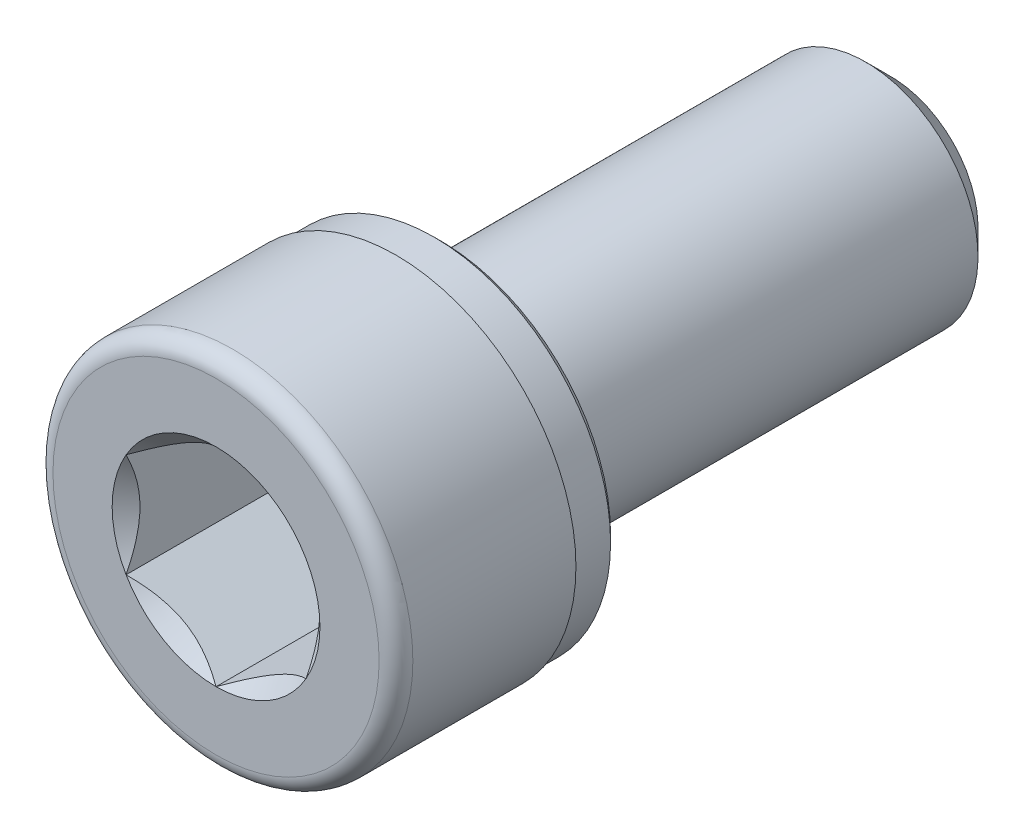
ISO-10303-21;
HEADER;
FILE_DESCRIPTION(('STEP AP214'),'2;1');
FILE_NAME('part.step','',(''),(''),'','','');
FILE_SCHEMA(('AUTOMOTIVE_DESIGN { 1 0 10303 214 1 1 1 1 }'));
ENDSEC;
DATA;
#1=APPLICATION_CONTEXT('core data for automotive mechanical design processes');
#2=APPLICATION_PROTOCOL_DEFINITION('international standard','automotive_design',2000,#1);
#3=PRODUCT_CONTEXT('',#1,'mechanical');
#4=PRODUCT('Part','Part','',(#3));
#5=PRODUCT_RELATED_PRODUCT_CATEGORY('part','',(#4));
#6=PRODUCT_DEFINITION_FORMATION('','',#4);
#7=PRODUCT_DEFINITION_CONTEXT('part definition',#1,'design');
#8=PRODUCT_DEFINITION('design','',#6,#7);
#9=PRODUCT_DEFINITION_SHAPE('','',#8);
#10=(LENGTH_UNIT() NAMED_UNIT(*) SI_UNIT(.MILLI.,.METRE.));
#11=(NAMED_UNIT(*) PLANE_ANGLE_UNIT() SI_UNIT($,.RADIAN.));
#12=(NAMED_UNIT(*) SI_UNIT($,.STERADIAN.) SOLID_ANGLE_UNIT());
#13=UNCERTAINTY_MEASURE_WITH_UNIT(LENGTH_MEASURE(1.E-05),#10,'distance_accuracy_value','');
#14=(GEOMETRIC_REPRESENTATION_CONTEXT(3) GLOBAL_UNCERTAINTY_ASSIGNED_CONTEXT((#13)) GLOBAL_UNIT_ASSIGNED_CONTEXT((#10,
#11,#12)) REPRESENTATION_CONTEXT('',''));
#15=CARTESIAN_POINT('',(0.,0.,0.));
#16=DIRECTION('',(0.,0.,1.));
#17=DIRECTION('',(1.,0.,0.));
#18=AXIS2_PLACEMENT_3D('',#15,#16,#17);
#19=CARTESIAN_POINT('',(0.,0.,5.));
#20=DIRECTION('',(0.,0.,1.));
#21=DIRECTION('',(0.,-1.,0.));
#22=AXIS2_PLACEMENT_3D('',#19,#20,#21);
#23=TOROIDAL_SURFACE('',#22,5.9,0.899999999999999);
#24=CARTESIAN_POINT('',(0.,-6.8,5.));
#25=VERTEX_POINT('',#24);
#26=VERTEX_LOOP('',#25);
#27=FACE_BOUND('',#26,.T.);
#28=ADVANCED_FACE('F42',(#27),#23,.T.);
#29=CLOSED_SHELL('',(#28));
#30=MANIFOLD_SOLID_BREP('B2',#29);
#31=CARTESIAN_POINT('',(0.,5.,5.));
#32=DIRECTION('',(0.,0.,1.));
#33=DIRECTION('',(0.,-1.,0.));
#34=AXIS2_PLACEMENT_3D('',#31,#32,#33);
#35=PLANE('',#34);
#36=CARTESIAN_POINT('',(0.,0.,5.));
#37=DIRECTION('',(0.,0.,1.));
#38=DIRECTION('',(0.,-1.,0.));
#39=AXIS2_PLACEMENT_3D('',#36,#37,#38);
#40=CIRCLE('',#39,7.54000000000001);
#41=CARTESIAN_POINT('',(0.,-7.54000000000001,5.));
#42=VERTEX_POINT('',#41);
#43=EDGE_CURVE('E185',#42,#42,#40,.F.);
#44=ORIENTED_EDGE('',*,*,#43,.T.);
#45=EDGE_LOOP('',(#44));
#46=FACE_BOUND('',#45,.T.);
#47=CARTESIAN_POINT('',(0.,0.,5.));
#48=DIRECTION('',(0.,0.,1.));
#49=DIRECTION('',(0.,-1.,0.));
#50=AXIS2_PLACEMENT_3D('',#47,#48,#49);
#51=CIRCLE('',#50,6.8);
#52=CARTESIAN_POINT('',(0.,-6.8,5.));
#53=VERTEX_POINT('',#52);
#54=EDGE_CURVE('E172',#53,#53,#51,.F.);
#55=ORIENTED_EDGE('',*,*,#54,.F.);
#56=EDGE_LOOP('',(#55));
#57=FACE_BOUND('',#56,.T.);
#58=ADVANCED_FACE('F55',(#46,#57),#35,.F.);
#59=CARTESIAN_POINT('',(0.,0.,7.));
#60=DIRECTION('',(0.,0.,-1.));
#61=DIRECTION('',(-1.,0.,0.));
#62=AXIS2_PLACEMENT_3D('',#59,#60,#61);
#63=PLANE('',#62);
#64=CARTESIAN_POINT('',(0.,0.,7.));
#65=DIRECTION('',(0.,0.,-1.));
#66=DIRECTION('',(-1.,0.,0.));
#67=AXIS2_PLACEMENT_3D('',#64,#65,#66);
#68=CIRCLE('',#67,7.84);
#69=CARTESIAN_POINT('',(-7.84,0.,7.));
#70=VERTEX_POINT('',#69);
#71=EDGE_CURVE('E175',#70,#70,#68,.T.);
#72=ORIENTED_EDGE('',*,*,#71,.F.);
#73=EDGE_LOOP('',(#72));
#74=FACE_BOUND('',#73,.T.);
#75=CARTESIAN_POINT('',(0.,0.,7.));
#76=DIRECTION('',(0.,0.,-1.));
#77=DIRECTION('',(-1.,0.,0.));
#78=AXIS2_PLACEMENT_3D('',#75,#76,#77);
#79=CIRCLE('',#78,8.);
#80=CARTESIAN_POINT('',(-8.,0.,7.));
#81=VERTEX_POINT('',#80);
#82=EDGE_CURVE('E178',#81,#81,#79,.T.);
#83=ORIENTED_EDGE('',*,*,#82,.T.);
#84=EDGE_LOOP('',(#83));
#85=FACE_BOUND('',#84,.T.);
#86=ADVANCED_FACE('F217',(#74,#85),#63,.T.);
#87=CARTESIAN_POINT('',(0.,0.,7.));
#88=DIRECTION('',(0.,0.,-1.));
#89=DIRECTION('',(-1.,0.,0.));
#90=AXIS2_PLACEMENT_3D('',#87,#88,#89);
#91=CYLINDRICAL_SURFACE('',#90,7.84);
#92=CARTESIAN_POINT('',(0.,0.,5.3));
#93=DIRECTION('',(0.,0.,1.));
#94=DIRECTION('',(1.,0.,0.));
#95=AXIS2_PLACEMENT_3D('',#92,#93,#94);
#96=CIRCLE('',#95,7.84);
#97=CARTESIAN_POINT('',(7.84,0.,5.3));
#98=VERTEX_POINT('',#97);
#99=EDGE_CURVE('E190',#98,#98,#96,.T.);
#100=ORIENTED_EDGE('',*,*,#99,.T.);
#101=EDGE_LOOP('',(#100));
#102=FACE_BOUND('',#101,.T.);
#103=ORIENTED_EDGE('',*,*,#71,.T.);
#104=EDGE_LOOP('',(#103));
#105=FACE_BOUND('',#104,.T.);
#106=ADVANCED_FACE('F209',(#102,#105),#91,.T.);
#107=CARTESIAN_POINT('',(0.,8.,15.));
#108=DIRECTION('',(0.,0.,-1.));
#109=DIRECTION('',(0.,1.,0.));
#110=AXIS2_PLACEMENT_3D('',#107,#108,#109);
#111=PLANE('',#110);
#112=CARTESIAN_POINT('',(0.,0.,15.));
#113=DIRECTION('',(0.,0.,1.));
#114=DIRECTION('',(1.,0.,0.));
#115=AXIS2_PLACEMENT_3D('',#112,#113,#114);
#116=CIRCLE('',#115,4.618802153517);
#117=CARTESIAN_POINT('',(0.,4.618802153517,15.));
#118=VERTEX_POINT('',#117);
#119=CARTESIAN_POINT('',(-4.,2.3094010767585,15.));
#120=VERTEX_POINT('',#119);
#121=EDGE_CURVE('E330',#118,#120,#116,.T.);
#122=ORIENTED_EDGE('',*,*,#121,.F.);
#123=CARTESIAN_POINT('',(4.,2.3094010767585,15.));
#124=VERTEX_POINT('',#123);
#125=EDGE_CURVE('E281',#124,#118,#116,.T.);
#126=ORIENTED_EDGE('',*,*,#125,.F.);
#127=CARTESIAN_POINT('',(4.,-2.3094010767585,15.));
#128=VERTEX_POINT('',#127);
#129=EDGE_CURVE('E75',#128,#124,#116,.T.);
#130=ORIENTED_EDGE('',*,*,#129,.F.);
#131=CARTESIAN_POINT('',(0.,-4.61880215351701,15.));
#132=VERTEX_POINT('',#131);
#133=EDGE_CURVE('E82',#132,#128,#116,.T.);
#134=ORIENTED_EDGE('',*,*,#133,.F.);
#135=CARTESIAN_POINT('',(-4.,-2.30940107675851,15.));
#136=VERTEX_POINT('',#135);
#137=EDGE_CURVE('E326',#136,#132,#116,.T.);
#138=ORIENTED_EDGE('',*,*,#137,.F.);
#139=EDGE_CURVE('E328',#120,#136,#116,.T.);
#140=ORIENTED_EDGE('',*,*,#139,.F.);
#141=EDGE_LOOP('',(#122,#126,#130,#134,#138,#140));
#142=FACE_BOUND('',#141,.T.);
#143=CARTESIAN_POINT('',(0.,0.,15.));
#144=DIRECTION('',(0.,0.,-1.));
#145=DIRECTION('',(0.,1.,0.));
#146=AXIS2_PLACEMENT_3D('',#143,#144,#145);
#147=CIRCLE('',#146,7.25);
#148=CARTESIAN_POINT('',(0.,7.25,15.));
#149=VERTEX_POINT('',#148);
#150=EDGE_CURVE('E193',#149,#149,#147,.F.);
#151=ORIENTED_EDGE('',*,*,#150,.T.);
#152=EDGE_LOOP('',(#151));
#153=FACE_BOUND('',#152,.T.);
#154=ADVANCED_FACE('F207',(#142,#153),#111,.F.);
#155=CARTESIAN_POINT('',(0.,0.,15.));
#156=DIRECTION('',(0.,0.,1.));
#157=DIRECTION('',(0.,-1.,0.));
#158=AXIS2_PLACEMENT_3D('',#155,#156,#157);
#159=CYLINDRICAL_SURFACE('',#158,8.);
#160=CARTESIAN_POINT('',(0.,0.,14.25));
#161=DIRECTION('',(0.,0.,-1.));
#162=DIRECTION('',(0.,1.,0.));
#163=AXIS2_PLACEMENT_3D('',#160,#161,#162);
#164=CIRCLE('',#163,8.);
#165=CARTESIAN_POINT('',(0.,8.,14.25));
#166=VERTEX_POINT('',#165);
#167=EDGE_CURVE('E69',#166,#166,#164,.T.);
#168=ORIENTED_EDGE('',*,*,#167,.T.);
#169=EDGE_LOOP('',(#168));
#170=FACE_BOUND('',#169,.T.);
#171=ORIENTED_EDGE('',*,*,#82,.F.);
#172=EDGE_LOOP('',(#171));
#173=FACE_BOUND('',#172,.T.);
#174=ADVANCED_FACE('F198',(#170,#173),#159,.T.);
#175=CARTESIAN_POINT('',(0.,0.,5.));
#176=DIRECTION('',(0.,0.,1.));
#177=DIRECTION('',(1.,0.,0.));
#178=AXIS2_PLACEMENT_3D('',#175,#176,#177);
#179=CONICAL_SURFACE('',#178,7.54000000000001,0.785398163397445);
#180=ORIENTED_EDGE('',*,*,#99,.F.);
#181=EDGE_LOOP('',(#180));
#182=FACE_BOUND('',#181,.T.);
#183=ORIENTED_EDGE('',*,*,#43,.F.);
#184=EDGE_LOOP('',(#183));
#185=FACE_BOUND('',#184,.T.);
#186=ADVANCED_FACE('F204',(#182,#185),#179,.T.);
#187=CARTESIAN_POINT('',(0.,0.,14.25));
#188=DIRECTION('',(0.,0.,-1.));
#189=DIRECTION('',(0.,1.,0.));
#190=AXIS2_PLACEMENT_3D('',#187,#188,#189);
#191=TOROIDAL_SURFACE('',#190,7.25,0.75);
#192=ORIENTED_EDGE('',*,*,#167,.F.);
#193=EDGE_LOOP('',(#192));
#194=FACE_BOUND('',#193,.T.);
#195=ORIENTED_EDGE('',*,*,#150,.F.);
#196=EDGE_LOOP('',(#195));
#197=FACE_BOUND('',#196,.T.);
#198=ADVANCED_FACE('F57',(#194,#197),#191,.T.);
#199=CARTESIAN_POINT('',(0.,0.,5.));
#200=DIRECTION('',(0.,0.,1.));
#201=DIRECTION('',(0.,-1.,0.));
#202=AXIS2_PLACEMENT_3D('',#199,#200,#201);
#203=TOROIDAL_SURFACE('',#202,5.9,0.899999999999999);
#204=CARTESIAN_POINT('',(0.,0.,5.));
#205=DIRECTION('',(0.,0.,1.));
#206=DIRECTION('',(0.,-1.,0.));
#207=AXIS2_PLACEMENT_3D('',#204,#205,#206);
#208=CIRCLE('',#207,5.);
#209=CARTESIAN_POINT('',(0.,-5.,5.));
#210=VERTEX_POINT('',#209);
#211=EDGE_CURVE('E159',#210,#210,#208,.T.);
#212=ORIENTED_EDGE('',*,*,#211,.T.);
#213=EDGE_LOOP('',(#212));
#214=FACE_BOUND('',#213,.T.);
#215=ORIENTED_EDGE('',*,*,#54,.T.);
#216=EDGE_LOOP('',(#215));
#217=FACE_BOUND('',#216,.T.);
#218=ADVANCED_FACE('F203',(#214,#217),#203,.F.);
#219=CARTESIAN_POINT('',(0.,0.,-15.));
#220=DIRECTION('',(0.,0.,1.));
#221=DIRECTION('',(0.,-1.,0.));
#222=AXIS2_PLACEMENT_3D('',#219,#220,#221);
#223=PLANE('',#222);
#224=CARTESIAN_POINT('',(0.,0.,-15.));
#225=DIRECTION('',(0.,0.,1.));
#226=DIRECTION('',(0.,-1.,0.));
#227=AXIS2_PLACEMENT_3D('',#224,#225,#226);
#228=CIRCLE('',#227,3.87499999999999);
#229=CARTESIAN_POINT('',(0.,-3.87499999999999,-15.));
#230=VERTEX_POINT('',#229);
#231=EDGE_CURVE('E182',#230,#230,#228,.F.);
#232=ORIENTED_EDGE('',*,*,#231,.T.);
#233=EDGE_LOOP('',(#232));
#234=FACE_BOUND('',#233,.T.);
#235=ADVANCED_FACE('F237',(#234),#223,.F.);
#236=CARTESIAN_POINT('',(0.,0.,-13.875));
#237=DIRECTION('',(0.,0.,1.));
#238=DIRECTION('',(0.,-1.,0.));
#239=AXIS2_PLACEMENT_3D('',#236,#237,#238);
#240=CONICAL_SURFACE('',#239,5.,0.785398163397451);
#241=ORIENTED_EDGE('',*,*,#231,.F.);
#242=EDGE_LOOP('',(#241));
#243=FACE_BOUND('',#242,.T.);
#244=CARTESIAN_POINT('',(0.,0.,-13.875));
#245=DIRECTION('',(0.,0.,1.));
#246=DIRECTION('',(0.,-1.,0.));
#247=AXIS2_PLACEMENT_3D('',#244,#245,#246);
#248=CIRCLE('',#247,5.);
#249=CARTESIAN_POINT('',(0.,-5.,-13.875));
#250=VERTEX_POINT('',#249);
#251=EDGE_CURVE('E179',#250,#250,#248,.T.);
#252=ORIENTED_EDGE('',*,*,#251,.F.);
#253=EDGE_LOOP('',(#252));
#254=FACE_BOUND('',#253,.T.);
#255=ADVANCED_FACE('F235',(#243,#254),#240,.T.);
#256=CARTESIAN_POINT('',(0.,0.,15.));
#257=DIRECTION('',(0.,0.,1.));
#258=DIRECTION('',(0.,-1.,0.));
#259=AXIS2_PLACEMENT_3D('',#256,#257,#258);
#260=CYLINDRICAL_SURFACE('',#259,5.);
#261=ORIENTED_EDGE('',*,*,#251,.T.);
#262=EDGE_LOOP('',(#261));
#263=FACE_BOUND('',#262,.T.);
#264=ORIENTED_EDGE('',*,*,#211,.F.);
#265=EDGE_LOOP('',(#264));
#266=FACE_BOUND('',#265,.T.);
#267=ADVANCED_FACE('F232',(#263,#266),#260,.T.);
#268=CARTESIAN_POINT('',(0.,0.,15.));
#269=DIRECTION('',(0.,0.,1.));
#270=DIRECTION('',(1.,0.,0.));
#271=AXIS2_PLACEMENT_3D('',#268,#269,#270);
#272=CONICAL_SURFACE('',#271,4.618802153517,0.78539816339745);
#273=ORIENTED_EDGE('',*,*,#121,.T.);
#274=CARTESIAN_POINT('',(0.0002,4.61891762357084,15.0001154743839));
#275=CARTESIAN_POINT('',(-0.0685809847183843,4.57920690352856,14.9604088559576));
#276=CARTESIAN_POINT('',(-0.137888304896503,4.53919230356691,14.9219204171131));
#277=CARTESIAN_POINT('',(-0.277664036763595,4.45849274714726,14.8477512237355));
#278=CARTESIAN_POINT('',(-0.348133057578706,4.41780743901013,14.8120720027316));
#279=CARTESIAN_POINT('',(-0.562100081603904,4.29427352009148,14.709500867651));
#280=CARTESIAN_POINT('',(-0.707416589267748,4.21037499527406,14.6475131110126));
#281=CARTESIAN_POINT('',(-1.00040214981326,4.04121970302444,14.5413558690094));
#282=CARTESIAN_POINT('',(-1.14799719663765,3.95600566300932,14.4969190554534));
#283=CARTESIAN_POINT('',(-1.44644641508887,3.78369592639707,14.4284489821294));
#284=CARTESIAN_POINT('',(-1.59729144640344,3.69660550696169,14.4043646378613));
#285=CARTESIAN_POINT('',(-1.85726690511357,3.5465086058927,14.3826348808605));
#286=CARTESIAN_POINT('',(-1.96606238220553,3.48369550790704,14.3794189146409));
#287=CARTESIAN_POINT('',(-2.18347675426334,3.35817126167378,14.384840058225));
#288=CARTESIAN_POINT('',(-2.29209557396636,3.29546015687917,14.3934813231718));
#289=CARTESIAN_POINT('',(-2.50830402737816,3.1706321481008,14.4221240384964));
#290=CARTESIAN_POINT('',(-2.61589237292034,3.10851598784035,14.4421381945513));
#291=CARTESIAN_POINT('',(-2.82922129322135,2.98535047827863,14.4924341573647));
#292=CARTESIAN_POINT('',(-2.93496200899965,2.92430104755973,14.5227151768784));
#293=CARTESIAN_POINT('',(-3.12267722089177,2.81592361944283,14.5850152526942));
#294=CARTESIAN_POINT('',(-3.20506731843131,2.76835567444981,14.6153962798601));
#295=CARTESIAN_POINT('',(-3.3683684620413,2.67407371522761,14.6810544645603));
#296=CARTESIAN_POINT('',(-3.44927946303276,2.62735972702479,14.7163317710398));
#297=CARTESIAN_POINT('',(-3.60936749601013,2.53493285809127,14.7909916870209));
#298=CARTESIAN_POINT('',(-3.68854908118624,2.48921734857498,14.8303613870036));
#299=CARTESIAN_POINT('',(-3.84544590098815,2.39863292742735,14.9126891081433));
#300=CARTESIAN_POINT('',(-3.92316199986076,2.35376351682288,14.9556449278019));
#301=CARTESIAN_POINT('',(-4.0002,2.30928560670466,15.0001154743839));
#302=B_SPLINE_CURVE_WITH_KNOTS('',3,(#274,#275,#276,#277,#278,#279,#280,#281,#282,#283,#284,
#285,#286,#287,#288,#289,#290,#291,#292,#293,#294,#295,#296,#297,#298,#299,#300,#301),
.UNSPECIFIED.,.F.,.F.,(4,2,2,2,2,2,2,2,2,2,2,2,2,4),(0.,0.266361961703665,0.532868334400113,
1.06875865685462,1.59613884594051,2.12219135055581,2.49866160599659,2.87526382203495,
3.25228760372077,3.62928248242858,3.92874944437161,4.22822551811345,4.52678401907574,
4.82516056577921),.UNSPECIFIED.);
#303=EDGE_CURVE('E40',#118,#120,#302,.T.);
#304=ORIENTED_EDGE('',*,*,#303,.F.);
#305=EDGE_LOOP('',(#273,#304));
#306=FACE_BOUND('',#305,.T.);
#307=ADVANCED_FACE('F234',(#306),#272,.F.);
#308=ORIENTED_EDGE('',*,*,#139,.T.);
#309=CARTESIAN_POINT('',(-4.,-4.56061126467049,16.4474302115873));
#310=CARTESIAN_POINT('',(-4.,-4.44935893768685,16.3638094484807));
#311=CARTESIAN_POINT('',(-4.,-4.33747868843095,16.2810104043077));
#312=CARTESIAN_POINT('',(-4.,-4.11221661854566,16.1174220167583));
#313=CARTESIAN_POINT('',(-4.,-3.99883442336718,16.0366331897104));
#314=CARTESIAN_POINT('',(-4.,-3.76949359664731,15.8768575176734));
#315=CARTESIAN_POINT('',(-4.,-3.6535218061246,15.7978894964585));
#316=CARTESIAN_POINT('',(-4.,-3.41960205043067,15.6429462084628));
#317=CARTESIAN_POINT('',(-4.,-3.30165422659701,15.5669707289295));
#318=CARTESIAN_POINT('',(-4.,-3.05682091264072,15.4145334625396));
#319=CARTESIAN_POINT('',(-4.,-2.92980413860216,15.3382814606441));
#320=CARTESIAN_POINT('',(-4.,-2.6728108349923,15.1908585486656));
#321=CARTESIAN_POINT('',(-4.,-2.54283384698311,15.1196884327514));
#322=CARTESIAN_POINT('',(-4.,-2.27994250666573,14.9839690403013));
#323=CARTESIAN_POINT('',(-4.,-2.14703828431971,14.9194002955017));
#324=CARTESIAN_POINT('',(-4.,-1.87763495066807,14.7983287044832));
#325=CARTESIAN_POINT('',(-4.,-1.74113748465469,14.741822240221));
#326=CARTESIAN_POINT('',(-4.,-1.4749192204273,14.642807661837));
#327=CARTESIAN_POINT('',(-4.,-1.34547625046033,14.5995603441547));
#328=CARTESIAN_POINT('',(-4.,-1.08351343272232,14.5234567893314));
#329=CARTESIAN_POINT('',(-4.,-0.950993369875227,14.490601280896));
#330=CARTESIAN_POINT('',(-4.,-0.685850221972422,14.4375308101498));
#331=CARTESIAN_POINT('',(-4.,-0.553270644459139,14.4171020044835));
#332=CARTESIAN_POINT('',(-4.,-0.286743981333443,14.3892743302309));
#333=CARTESIAN_POINT('',(-4.,-0.152797124914882,14.3818733127636));
#334=CARTESIAN_POINT('',(-4.,0.110503819921534,14.3806328504323));
#335=CARTESIAN_POINT('',(-4.,0.239855906454457,14.3863314896316));
#336=CARTESIAN_POINT('',(-4.,0.49742982785928,14.4099667576234));
#337=CARTESIAN_POINT('',(-4.,0.625651550330801,14.42790458985));
#338=CARTESIAN_POINT('',(-4.,0.882203866772094,14.4753524041991));
#339=CARTESIAN_POINT('',(-4.,1.01049775152092,14.505057764738));
#340=CARTESIAN_POINT('',(-4.,1.26429558304591,14.5744699283293));
#341=CARTESIAN_POINT('',(-4.,1.38979977754383,14.6141758394504));
#342=CARTESIAN_POINT('',(-4.,1.65043147588143,14.7064243769301));
#343=CARTESIAN_POINT('',(-4.,1.78523907890682,14.7598619775169));
#344=CARTESIAN_POINT('',(-4.,2.05134346194951,14.8749271683156));
#345=CARTESIAN_POINT('',(-4.,2.18263855869525,14.9365586036389));
#346=CARTESIAN_POINT('',(-4.,2.44236512339527,15.0665437141592));
#347=CARTESIAN_POINT('',(-4.,2.57078589475899,15.134918590743));
#348=CARTESIAN_POINT('',(-4.,2.82466883682566,15.2768776928912));
#349=CARTESIAN_POINT('',(-4.,2.95013147755334,15.3504610833238));
#350=CARTESIAN_POINT('',(-4.,3.19229886366067,15.4980352407636));
#351=CARTESIAN_POINT('',(-4.,3.30912826199456,15.5718225329515));
#352=CARTESIAN_POINT('',(-4.,3.54078186467888,15.7224898299395));
#353=CARTESIAN_POINT('',(-4.,3.65560591584863,15.7993700695288));
#354=CARTESIAN_POINT('',(-4.,3.88257830086984,15.9550327667901));
#355=CARTESIAN_POINT('',(-4.,3.99474081189922,16.0337946266415));
#356=CARTESIAN_POINT('',(-4.,4.21753463695392,16.1933936070447));
#357=CARTESIAN_POINT('',(-4.,4.32816636324192,16.2742301514253));
#358=CARTESIAN_POINT('',(-4.,4.43815737538549,16.3559146505406));
#359=B_SPLINE_CURVE_WITH_KNOTS('',3,(#309,#310,#311,#312,#313,#314,#315,#316,#317,#318,#319,
#320,#321,#322,#323,#324,#325,#326,#327,#328,#329,#330,#331,#332,#333,#334,#335,#336,#337,#338,
#339,#340,#341,#342,#343,#344,#345,#346,#347,#348,#349,#350,#351,#352,#353,#354,#355,#356,#357,
#358),.UNSPECIFIED.,.F.,.F.,(4,2,2,2,2,2,2,2,2,2,2,2,2,2,2,2,2,2,2,2,2,2,2,2,4),(0.,
0.417531577072436,0.835169313532005,1.25604456754426,1.67688984552423,2.12123727007314,
2.56565398346986,3.00871976789769,3.45158609172114,3.86065408772187,4.26975076246614,
4.67159220320876,5.07336735562155,5.4611934936016,5.84905777057154,6.24365153903499,
6.63821012683756,7.07290810341686,7.50781079502828,7.94412727050893,8.38037394489601,
8.79485622469619,9.20937002791873,9.62050709845191,10.0315311997902),.UNSPECIFIED.);
#360=EDGE_CURVE('E272',#120,#136,#359,.F.);
#361=ORIENTED_EDGE('',*,*,#360,.F.);
#362=EDGE_LOOP('',(#308,#361));
#363=FACE_BOUND('',#362,.T.);
#364=ADVANCED_FACE('F335',(#363),#272,.F.);
#365=ORIENTED_EDGE('',*,*,#137,.T.);
#366=CARTESIAN_POINT('',(-4.0002,-2.30928560670467,15.0001154743839));
#367=CARTESIAN_POINT('',(-3.93141901528161,-2.34899632674695,14.9604088559576));
#368=CARTESIAN_POINT('',(-3.86211169510349,-2.3890109267086,14.9219204171131));
#369=CARTESIAN_POINT('',(-3.7223359632364,-2.46971048312824,14.8477512237355));
#370=CARTESIAN_POINT('',(-3.65186694242129,-2.51039579126538,14.8120720027316));
#371=CARTESIAN_POINT('',(-3.43789991839609,-2.63392971018403,14.709500867651));
#372=CARTESIAN_POINT('',(-3.29258341073225,-2.71782823500144,14.6475131110126));
#373=CARTESIAN_POINT('',(-2.99959785018674,-2.88698352725107,14.5413558690094));
#374=CARTESIAN_POINT('',(-2.85200280336235,-2.97219756726618,14.4969190554534));
#375=CARTESIAN_POINT('',(-2.55355358491113,-3.14450730387843,14.4284489821294));
#376=CARTESIAN_POINT('',(-2.40270855359656,-3.23159772331382,14.4043646378613));
#377=CARTESIAN_POINT('',(-2.14273309488643,-3.3816946243828,14.3826348808605));
#378=CARTESIAN_POINT('',(-2.03393761779447,-3.44450772236846,14.3794189146409));
#379=CARTESIAN_POINT('',(-1.81652324573666,-3.57003196860173,14.384840058225));
#380=CARTESIAN_POINT('',(-1.70790442603364,-3.63274307339633,14.3934813231718));
#381=CARTESIAN_POINT('',(-1.49169597262184,-3.75757108217471,14.4221240384964));
#382=CARTESIAN_POINT('',(-1.38410762707966,-3.81968724243515,14.4421381945513));
#383=CARTESIAN_POINT('',(-1.17077870677865,-3.94285275199687,14.4924341573647));
#384=CARTESIAN_POINT('',(-1.06503799100035,-4.00390218271577,14.5227151768784));
#385=CARTESIAN_POINT('',(-0.877322779108232,-4.11227961083268,14.5850152526942));
#386=CARTESIAN_POINT('',(-0.794932681568683,-4.15984755582569,14.6153962798601));
#387=CARTESIAN_POINT('',(-0.631631537958699,-4.25412951504789,14.6810544645603));
#388=CARTESIAN_POINT('',(-0.550720536967232,-4.30084350325072,14.7163317710398));
#389=CARTESIAN_POINT('',(-0.390632503989862,-4.39327037218424,14.7909916870209));
#390=CARTESIAN_POINT('',(-0.311450918813757,-4.43898588170052,14.8303613870036));
#391=CARTESIAN_POINT('',(-0.154554099011841,-4.52957030284816,14.9126891081433));
#392=CARTESIAN_POINT('',(-0.0768380001392311,-4.57443971345262,14.955644927802));
#393=CARTESIAN_POINT('',(0.00020000000000342,-4.61891762357084,15.0001154743839));
#394=B_SPLINE_CURVE_WITH_KNOTS('',3,(#366,#367,#368,#369,#370,#371,#372,#373,#374,#375,#376,
#377,#378,#379,#380,#381,#382,#383,#384,#385,#386,#387,#388,#389,#390,#391,#392,#393),
.UNSPECIFIED.,.F.,.F.,(4,2,2,2,2,2,2,2,2,2,2,2,2,4),(0.,0.266361961703664,0.532868334400111,
1.06875865685462,1.59613884594051,2.1221913505558,2.49866160599658,2.87526382203494,
3.25228760372076,3.62928248242858,3.92874944437161,4.22822551811345,4.52678401907573,
4.82516056577921),.UNSPECIFIED.);
#395=EDGE_CURVE('E280',#136,#132,#394,.T.);
#396=ORIENTED_EDGE('',*,*,#395,.F.);
#397=EDGE_LOOP('',(#365,#396));
#398=FACE_BOUND('',#397,.T.);
#399=ADVANCED_FACE('F337',(#398),#272,.F.);
#400=ORIENTED_EDGE('',*,*,#133,.T.);
#401=CARTESIAN_POINT('',(-0.000199999999996554,-4.61891762357084,15.0001154743839));
#402=CARTESIAN_POINT('',(0.0685809847183869,-4.57920690352856,14.9604088559576));
#403=CARTESIAN_POINT('',(0.137888304896505,-4.53919230356691,14.9219204171131));
#404=CARTESIAN_POINT('',(0.277664036763597,-4.45849274714727,14.8477512237355));
#405=CARTESIAN_POINT('',(0.348133057578708,-4.41780743901013,14.8120720027316));
#406=CARTESIAN_POINT('',(0.562100081603906,-4.29427352009148,14.709500867651));
#407=CARTESIAN_POINT('',(0.707416589267749,-4.21037499527406,14.6475131110126));
#408=CARTESIAN_POINT('',(1.00040214981326,-4.04121970302444,14.5413558690094));
#409=CARTESIAN_POINT('',(1.14799719663765,-3.95600566300932,14.4969190554534));
#410=CARTESIAN_POINT('',(1.44644641508887,-3.78369592639708,14.4284489821294));
#411=CARTESIAN_POINT('',(1.59729144640344,-3.69660550696169,14.4043646378613));
#412=CARTESIAN_POINT('',(1.85726690511356,-3.54650860589271,14.3826348808605));
#413=CARTESIAN_POINT('',(1.96606238220553,-3.48369550790704,14.3794189146409));
#414=CARTESIAN_POINT('',(2.18347675426333,-3.35817126167378,14.384840058225));
#415=CARTESIAN_POINT('',(2.29209557396636,-3.29546015687918,14.3934813231718));
#416=CARTESIAN_POINT('',(2.50830402737816,-3.1706321481008,14.4221240384964));
#417=CARTESIAN_POINT('',(2.61589237292034,-3.10851598784036,14.4421381945513));
#418=CARTESIAN_POINT('',(2.82922129322135,-2.98535047827864,14.4924341573647));
#419=CARTESIAN_POINT('',(2.93496200899965,-2.92430104755973,14.5227151768784));
#420=CARTESIAN_POINT('',(3.12267722089177,-2.81592361944283,14.5850152526942));
#421=CARTESIAN_POINT('',(3.20506731843131,-2.76835567444981,14.6153962798601));
#422=CARTESIAN_POINT('',(3.3683684620413,-2.67407371522762,14.6810544645603));
#423=CARTESIAN_POINT('',(3.44927946303276,-2.62735972702479,14.7163317710398));
#424=CARTESIAN_POINT('',(3.60936749601014,-2.53493285809127,14.7909916870209));
#425=CARTESIAN_POINT('',(3.68854908118624,-2.48921734857498,14.8303613870036));
#426=CARTESIAN_POINT('',(3.84544590098816,-2.39863292742735,14.9126891081433));
#427=CARTESIAN_POINT('',(3.92316199986077,-2.35376351682288,14.955644927802));
#428=CARTESIAN_POINT('',(4.0002,-2.30928560670466,15.0001154743839));
#429=B_SPLINE_CURVE_WITH_KNOTS('',3,(#401,#402,#403,#404,#405,#406,#407,#408,#409,#410,#411,
#412,#413,#414,#415,#416,#417,#418,#419,#420,#421,#422,#423,#424,#425,#426,#427,#428),
.UNSPECIFIED.,.F.,.F.,(4,2,2,2,2,2,2,2,2,2,2,2,2,4),(0.,0.266361961703663,0.532868334400111,
1.06875865685462,1.59613884594051,2.1221913505558,2.49866160599658,2.87526382203494,
3.25228760372076,3.62928248242858,3.92874944437161,4.22822551811345,4.52678401907573,
4.82516056577921),.UNSPECIFIED.);
#430=EDGE_CURVE('E299',#132,#128,#429,.T.);
#431=ORIENTED_EDGE('',*,*,#430,.F.);
#432=EDGE_LOOP('',(#400,#431));
#433=FACE_BOUND('',#432,.T.);
#434=ADVANCED_FACE('F339',(#433),#272,.F.);
#435=ORIENTED_EDGE('',*,*,#129,.T.);
#436=CARTESIAN_POINT('',(4.,-4.56061126592828,16.4474302125329));
#437=CARTESIAN_POINT('',(4.,-4.44935893890959,16.3638094493899));
#438=CARTESIAN_POINT('',(4.,-4.33747868961852,16.2810104051806));
#439=CARTESIAN_POINT('',(4.,-4.11221661966255,16.1174220175587));
#440=CARTESIAN_POINT('',(4.,-3.99883442444854,16.0366331904748));
#441=CARTESIAN_POINT('',(4.,-3.76949359765642,15.8768575183654));
#442=CARTESIAN_POINT('',(4.,-3.65352180709697,15.7978894971141));
#443=CARTESIAN_POINT('',(4.,-3.4196020513289,15.6429462090463));
#444=CARTESIAN_POINT('',(4.,-3.30165422745783,15.5669707294772));
#445=CARTESIAN_POINT('',(4.,-3.05682091342089,15.4145334630129));
#446=CARTESIAN_POINT('',(4.,-2.92980413933898,15.338281461079));
#447=CARTESIAN_POINT('',(4.,-2.67281083564086,15.1908585490254));
#448=CARTESIAN_POINT('',(4.,-2.54283384758675,15.1196884330746));
#449=CARTESIAN_POINT('',(4.,-2.27994250717792,14.9839690405543));
#450=CARTESIAN_POINT('',(4.,-2.14703828478537,14.919400295721));
#451=CARTESIAN_POINT('',(4.,-1.8776349510382,14.7983287046395));
#452=CARTESIAN_POINT('',(4.,-1.74113748497581,14.7418222403479));
#453=CARTESIAN_POINT('',(4.,-1.4749192207271,14.6428076619416));
#454=CARTESIAN_POINT('',(4.,-1.34547625078992,14.5995603442608));
#455=CARTESIAN_POINT('',(4.,-1.08351343311244,14.5234567894345));
#456=CARTESIAN_POINT('',(4.,-0.950993370296072,14.4906012809944));
#457=CARTESIAN_POINT('',(4.,-0.685850222453687,14.4375308102322));
#458=CARTESIAN_POINT('',(4.,-0.553270644970084,14.4171020045546));
#459=CARTESIAN_POINT('',(4.,-0.286743981902708,14.3892743302726));
#460=CARTESIAN_POINT('',(4.,-0.152797125512787,14.3818733127874));
#461=CARTESIAN_POINT('',(4.,0.110503819269824,14.3806328504152));
#462=CARTESIAN_POINT('',(4.,0.239855905777508,14.3863314895917));
#463=CARTESIAN_POINT('',(4.,0.497429827134325,14.4099667575346));
#464=CARTESIAN_POINT('',(4.,0.625651549583077,14.4279045897349));
#465=CARTESIAN_POINT('',(4.,0.882203865979419,14.4753524040289));
#466=CARTESIAN_POINT('',(4.,1.01049775070613,14.5050577645387));
#467=CARTESIAN_POINT('',(4.,1.26429558218898,14.5744699280713));
#468=CARTESIAN_POINT('',(4.,1.38979977666688,14.6141758391627));
#469=CARTESIAN_POINT('',(4.,1.65043147489879,14.7064243765572));
#470=CARTESIAN_POINT('',(4.,1.7852390778404,14.7598619770838));
#471=CARTESIAN_POINT('',(4.,2.05134346071982,14.8749271677559));
#472=CARTESIAN_POINT('',(4.,2.18263855738607,14.9365586030128));
#473=CARTESIAN_POINT('',(4.,2.44236512192995,15.0665437133966));
#474=CARTESIAN_POINT('',(4.,2.57078589321704,15.1349185899101));
#475=CARTESIAN_POINT('',(4.,2.82466883513296,15.2768776919155));
#476=CARTESIAN_POINT('',(4.,2.95013147578651,15.3504610822756));
#477=CARTESIAN_POINT('',(4.,3.19229886175906,15.4980352395777));
#478=CARTESIAN_POINT('',(4.,3.30912826003205,15.5718225317008));
#479=CARTESIAN_POINT('',(4.,3.54078186259544,15.7224898285588));
#480=CARTESIAN_POINT('',(4.,3.65560591370517,15.7993700680829));
#481=CARTESIAN_POINT('',(4.,3.88257829860776,15.9550327652147));
#482=CARTESIAN_POINT('',(4.,3.99474080957856,16.0337946250017));
#483=CARTESIAN_POINT('',(4.,4.21753463451645,16.1933936052762));
#484=CARTESIAN_POINT('',(4.,4.32816636074624,16.2742301495925));
#485=CARTESIAN_POINT('',(4.,4.43815737283168,16.3559146486436));
#486=B_SPLINE_CURVE_WITH_KNOTS('',3,(#436,#437,#438,#439,#440,#441,#442,#443,#444,#445,#446,
#447,#448,#449,#450,#451,#452,#453,#454,#455,#456,#457,#458,#459,#460,#461,#462,#463,#464,#465,
#466,#467,#468,#469,#470,#471,#472,#473,#474,#475,#476,#477,#478,#479,#480,#481,#482,#483,#484,
#485),.UNSPECIFIED.,.F.,.F.,(4,2,2,2,2,2,2,2,2,2,2,2,2,2,2,2,2,2,2,2,2,2,2,2,4),(0.,
0.41753157722205,0.835169313831275,1.25604456799599,1.67688984612841,2.12123727084814,
2.56565398441578,3.00871976901311,3.45158609300579,3.86065408892065,4.26975076357921,
4.6715922042395,5.07336735656996,5.4611934944717,5.84905777136323,6.24365153974245,
6.63821012746084,7.07290810374025,7.50781079505142,7.9441272702301,8.38037394431535,
8.79485622385718,9.20937002682133,9.62050709709964,10.0315311981831),.UNSPECIFIED.);
#487=EDGE_CURVE('E141',#128,#124,#486,.T.);
#488=ORIENTED_EDGE('',*,*,#487,.F.);
#489=EDGE_LOOP('',(#435,#488));
#490=FACE_BOUND('',#489,.T.);
#491=ADVANCED_FACE('F291',(#490),#272,.F.);
#492=ORIENTED_EDGE('',*,*,#125,.T.);
#493=CARTESIAN_POINT('',(4.0002,2.30928560670467,15.0001154743839));
#494=CARTESIAN_POINT('',(3.93141901528161,2.34899632674696,14.9604088559576));
#495=CARTESIAN_POINT('',(3.8621116951035,2.3890109267086,14.9219204171131));
#496=CARTESIAN_POINT('',(3.7223359632364,2.46971048312825,14.8477512237355));
#497=CARTESIAN_POINT('',(3.65186694242129,2.51039579126538,14.8120720027316));
#498=CARTESIAN_POINT('',(3.43789991839609,2.63392971018403,14.709500867651));
#499=CARTESIAN_POINT('',(3.29258341073225,2.71782823500145,14.6475131110126));
#500=CARTESIAN_POINT('',(2.99959785018674,2.88698352725107,14.5413558690094));
#501=CARTESIAN_POINT('',(2.85200280336235,2.97219756726619,14.4969190554534));
#502=CARTESIAN_POINT('',(2.55355358491113,3.14450730387843,14.4284489821295));
#503=CARTESIAN_POINT('',(2.40270855359656,3.23159772331382,14.4043646378613));
#504=CARTESIAN_POINT('',(2.14273309488644,3.3816946243828,14.3826348808605));
#505=CARTESIAN_POINT('',(2.03393761779447,3.44450772236846,14.3794189146409));
#506=CARTESIAN_POINT('',(1.81652324573667,3.57003196860173,14.384840058225));
#507=CARTESIAN_POINT('',(1.70790442603364,3.63274307339633,14.3934813231718));
#508=CARTESIAN_POINT('',(1.49169597262184,3.75757108217471,14.4221240384964));
#509=CARTESIAN_POINT('',(1.38410762707966,3.81968724243515,14.4421381945513));
#510=CARTESIAN_POINT('',(1.17077870677865,3.94285275199687,14.4924341573647));
#511=CARTESIAN_POINT('',(1.06503799100035,4.00390218271578,14.5227151768784));
#512=CARTESIAN_POINT('',(0.877322779108233,4.11227961083268,14.5850152526942));
#513=CARTESIAN_POINT('',(0.794932681568684,4.15984755582569,14.6153962798601));
#514=CARTESIAN_POINT('',(0.631631537958701,4.25412951504789,14.6810544645603));
#515=CARTESIAN_POINT('',(0.550720536967234,4.30084350325072,14.7163317710398));
#516=CARTESIAN_POINT('',(0.390632503989864,4.39327037218424,14.7909916870209));
#517=CARTESIAN_POINT('',(0.311450918813759,4.43898588170052,14.8303613870036));
#518=CARTESIAN_POINT('',(0.154554099011843,4.52957030284816,14.9126891081433));
#519=CARTESIAN_POINT('',(0.0768380001392343,4.57443971345262,14.955644927802));
#520=CARTESIAN_POINT('',(-0.000200000000000098,4.61891762357084,15.0001154743839));
#521=B_SPLINE_CURVE_WITH_KNOTS('',3,(#493,#494,#495,#496,#497,#498,#499,#500,#501,#502,#503,
#504,#505,#506,#507,#508,#509,#510,#511,#512,#513,#514,#515,#516,#517,#518,#519,#520),
.UNSPECIFIED.,.F.,.F.,(4,2,2,2,2,2,2,2,2,2,2,2,2,4),(0.,0.266361961703663,0.532868334400111,
1.06875865685462,1.5961388459405,2.1221913505558,2.49866160599658,2.87526382203494,
3.25228760372077,3.62928248242858,3.92874944437161,4.22822551811345,4.52678401907573,
4.82516056577921),.UNSPECIFIED.);
#522=EDGE_CURVE('E122',#124,#118,#521,.T.);
#523=ORIENTED_EDGE('',*,*,#522,.F.);
#524=EDGE_LOOP('',(#492,#523));
#525=FACE_BOUND('',#524,.T.);
#526=ADVANCED_FACE('F287',(#525),#272,.F.);
#527=CARTESIAN_POINT('',(0.,0.,7.5));
#528=DIRECTION('',(0.,0.,1.));
#529=DIRECTION('',(1.,0.,0.));
#530=AXIS2_PLACEMENT_3D('',#527,#528,#529);
#531=PLANE('',#530);
#532=DIRECTION('',(-0.866025403784439,0.499999999999999,0.));
#533=VECTOR('',#532,1.);
#534=CARTESIAN_POINT('',(4.,2.30940107675851,7.5));
#535=LINE('',#534,#533);
#536=CARTESIAN_POINT('',(4.,2.30940107675851,7.5));
#537=VERTEX_POINT('',#536);
#538=CARTESIAN_POINT('',(0.,4.618802153517,7.5));
#539=VERTEX_POINT('',#538);
#540=EDGE_CURVE('E120',#537,#539,#535,.T.);
#541=ORIENTED_EDGE('',*,*,#540,.T.);
#542=DIRECTION('',(-0.866025403784438,-0.500000000000001,0.));
#543=VECTOR('',#542,1.);
#544=CARTESIAN_POINT('',(0.,4.618802153517,7.5));
#545=LINE('',#544,#543);
#546=CARTESIAN_POINT('',(-4.,2.3094010767585,7.5));
#547=VERTEX_POINT('',#546);
#548=EDGE_CURVE('E129',#539,#547,#545,.T.);
#549=ORIENTED_EDGE('',*,*,#548,.T.);
#550=DIRECTION('',(0.,-1.,0.));
#551=VECTOR('',#550,1.);
#552=CARTESIAN_POINT('',(-4.,2.3094010767585,7.5));
#553=LINE('',#552,#551);
#554=CARTESIAN_POINT('',(-4.,-2.3094010767585,7.5));
#555=VERTEX_POINT('',#554);
#556=EDGE_CURVE('E135',#547,#555,#553,.T.);
#557=ORIENTED_EDGE('',*,*,#556,.T.);
#558=DIRECTION('',(0.866025403784439,-0.5,0.));
#559=VECTOR('',#558,1.);
#560=CARTESIAN_POINT('',(-4.,-2.3094010767585,7.5));
#561=LINE('',#560,#559);
#562=CARTESIAN_POINT('',(0.,-4.618802153517,7.5));
#563=VERTEX_POINT('',#562);
#564=EDGE_CURVE('E151',#555,#563,#561,.T.);
#565=ORIENTED_EDGE('',*,*,#564,.T.);
#566=DIRECTION('',(0.866025403784439,0.5,0.));
#567=VECTOR('',#566,1.);
#568=CARTESIAN_POINT('',(0.,-4.618802153517,7.5));
#569=LINE('',#568,#567);
#570=CARTESIAN_POINT('',(4.,-2.3094010767585,7.5));
#571=VERTEX_POINT('',#570);
#572=EDGE_CURVE('E154',#563,#571,#569,.T.);
#573=ORIENTED_EDGE('',*,*,#572,.T.);
#574=DIRECTION('',(0.,1.,0.));
#575=VECTOR('',#574,1.);
#576=CARTESIAN_POINT('',(4.,-2.3094010767585,7.5));
#577=LINE('',#576,#575);
#578=EDGE_CURVE('E126',#571,#537,#577,.T.);
#579=ORIENTED_EDGE('',*,*,#578,.T.);
#580=EDGE_LOOP('',(#541,#549,#557,#565,#573,#579));
#581=FACE_BOUND('',#580,.T.);
#582=ADVANCED_FACE('F137',(#581),#531,.T.);
#583=CARTESIAN_POINT('',(0.,4.618802153517,7.5));
#584=DIRECTION('',(-0.500000000000001,0.866025403784438,0.));
#585=DIRECTION('',(-0.866025403784438,-0.500000000000001,0.));
#586=AXIS2_PLACEMENT_3D('',#583,#584,#585);
#587=PLANE('',#586);
#588=DIRECTION('',(0.,0.,1.));
#589=VECTOR('',#588,1.);
#590=CARTESIAN_POINT('',(0.,4.618802153517,7.5));
#591=LINE('',#590,#589);
#592=EDGE_CURVE('E115',#539,#118,#591,.T.);
#593=ORIENTED_EDGE('',*,*,#592,.T.);
#594=ORIENTED_EDGE('',*,*,#303,.T.);
#595=DIRECTION('',(0.,0.,1.));
#596=VECTOR('',#595,1.);
#597=CARTESIAN_POINT('',(-4.,2.3094010767585,7.5));
#598=LINE('',#597,#596);
#599=EDGE_CURVE('E125',#547,#120,#598,.T.);
#600=ORIENTED_EDGE('',*,*,#599,.F.);
#601=ORIENTED_EDGE('',*,*,#548,.F.);
#602=EDGE_LOOP('',(#593,#594,#600,#601));
#603=FACE_BOUND('',#602,.T.);
#604=ADVANCED_FACE('F130',(#603),#587,.F.);
#605=CARTESIAN_POINT('',(-4.,2.3094010767585,7.5));
#606=DIRECTION('',(-1.,0.,0.));
#607=DIRECTION('',(0.,-1.,0.));
#608=AXIS2_PLACEMENT_3D('',#605,#606,#607);
#609=PLANE('',#608);
#610=ORIENTED_EDGE('',*,*,#599,.T.);
#611=ORIENTED_EDGE('',*,*,#360,.T.);
#612=DIRECTION('',(0.,0.,1.));
#613=VECTOR('',#612,1.);
#614=CARTESIAN_POINT('',(-4.,-2.3094010767585,7.5));
#615=LINE('',#614,#613);
#616=EDGE_CURVE('E166',#555,#136,#615,.T.);
#617=ORIENTED_EDGE('',*,*,#616,.F.);
#618=ORIENTED_EDGE('',*,*,#556,.F.);
#619=EDGE_LOOP('',(#610,#611,#617,#618));
#620=FACE_BOUND('',#619,.T.);
#621=ADVANCED_FACE('F263',(#620),#609,.F.);
#622=CARTESIAN_POINT('',(-4.,-2.3094010767585,7.5));
#623=DIRECTION('',(-0.5,-0.866025403784439,0.));
#624=DIRECTION('',(0.866025403784439,-0.5,0.));
#625=AXIS2_PLACEMENT_3D('',#622,#623,#624);
#626=PLANE('',#625);
#627=ORIENTED_EDGE('',*,*,#616,.T.);
#628=ORIENTED_EDGE('',*,*,#395,.T.);
#629=DIRECTION('',(0.,0.,1.));
#630=VECTOR('',#629,1.);
#631=CARTESIAN_POINT('',(0.,-4.618802153517,7.5));
#632=LINE('',#631,#630);
#633=EDGE_CURVE('E163',#563,#132,#632,.T.);
#634=ORIENTED_EDGE('',*,*,#633,.F.);
#635=ORIENTED_EDGE('',*,*,#564,.F.);
#636=EDGE_LOOP('',(#627,#628,#634,#635));
#637=FACE_BOUND('',#636,.T.);
#638=ADVANCED_FACE('F267',(#637),#626,.F.);
#639=CARTESIAN_POINT('',(0.,-4.618802153517,7.5));
#640=DIRECTION('',(0.5,-0.866025403784438,0.));
#641=DIRECTION('',(0.866025403784439,0.5,0.));
#642=AXIS2_PLACEMENT_3D('',#639,#640,#641);
#643=PLANE('',#642);
#644=ORIENTED_EDGE('',*,*,#633,.T.);
#645=ORIENTED_EDGE('',*,*,#430,.T.);
#646=DIRECTION('',(0.,0.,1.));
#647=VECTOR('',#646,1.);
#648=CARTESIAN_POINT('',(4.,-2.3094010767585,7.5));
#649=LINE('',#648,#647);
#650=EDGE_CURVE('E160',#571,#128,#649,.T.);
#651=ORIENTED_EDGE('',*,*,#650,.F.);
#652=ORIENTED_EDGE('',*,*,#572,.F.);
#653=EDGE_LOOP('',(#644,#645,#651,#652));
#654=FACE_BOUND('',#653,.T.);
#655=ADVANCED_FACE('F311',(#654),#643,.F.);
#656=CARTESIAN_POINT('',(4.,-2.3094010767585,7.5));
#657=DIRECTION('',(1.,0.,0.));
#658=DIRECTION('',(0.,1.,0.));
#659=AXIS2_PLACEMENT_3D('',#656,#657,#658);
#660=PLANE('',#659);
#661=ORIENTED_EDGE('',*,*,#650,.T.);
#662=ORIENTED_EDGE('',*,*,#487,.T.);
#663=DIRECTION('',(0.,0.,1.));
#664=VECTOR('',#663,1.);
#665=CARTESIAN_POINT('',(4.,2.30940107675851,7.5));
#666=LINE('',#665,#664);
#667=EDGE_CURVE('E157',#537,#124,#666,.T.);
#668=ORIENTED_EDGE('',*,*,#667,.F.);
#669=ORIENTED_EDGE('',*,*,#578,.F.);
#670=EDGE_LOOP('',(#661,#662,#668,#669));
#671=FACE_BOUND('',#670,.T.);
#672=ADVANCED_FACE('F259',(#671),#660,.F.);
#673=CARTESIAN_POINT('',(4.,2.30940107675851,7.5));
#674=DIRECTION('',(0.499999999999999,0.866025403784439,0.));
#675=DIRECTION('',(-0.866025403784439,0.499999999999999,0.));
#676=AXIS2_PLACEMENT_3D('',#673,#674,#675);
#677=PLANE('',#676);
#678=ORIENTED_EDGE('',*,*,#667,.T.);
#679=ORIENTED_EDGE('',*,*,#522,.T.);
#680=ORIENTED_EDGE('',*,*,#592,.F.);
#681=ORIENTED_EDGE('',*,*,#540,.F.);
#682=EDGE_LOOP('',(#678,#679,#680,#681));
#683=FACE_BOUND('',#682,.T.);
#684=ADVANCED_FACE('F118',(#683),#677,.F.);
#685=CLOSED_SHELL('',(#58,#86,#106,#154,#174,#186,#198,#218,#235,#255,#267,#307,#364,#399,#434,
#491,#526,#582,#604,#621,#638,#655,#672,#684));
#686=MANIFOLD_SOLID_BREP('B7',#685);
#687=ADVANCED_BREP_SHAPE_REPRESENTATION('',(#18,#30,#686),#14);
#688=SHAPE_DEFINITION_REPRESENTATION(#9,#687);
ENDSEC;
END-ISO-10303-21;
